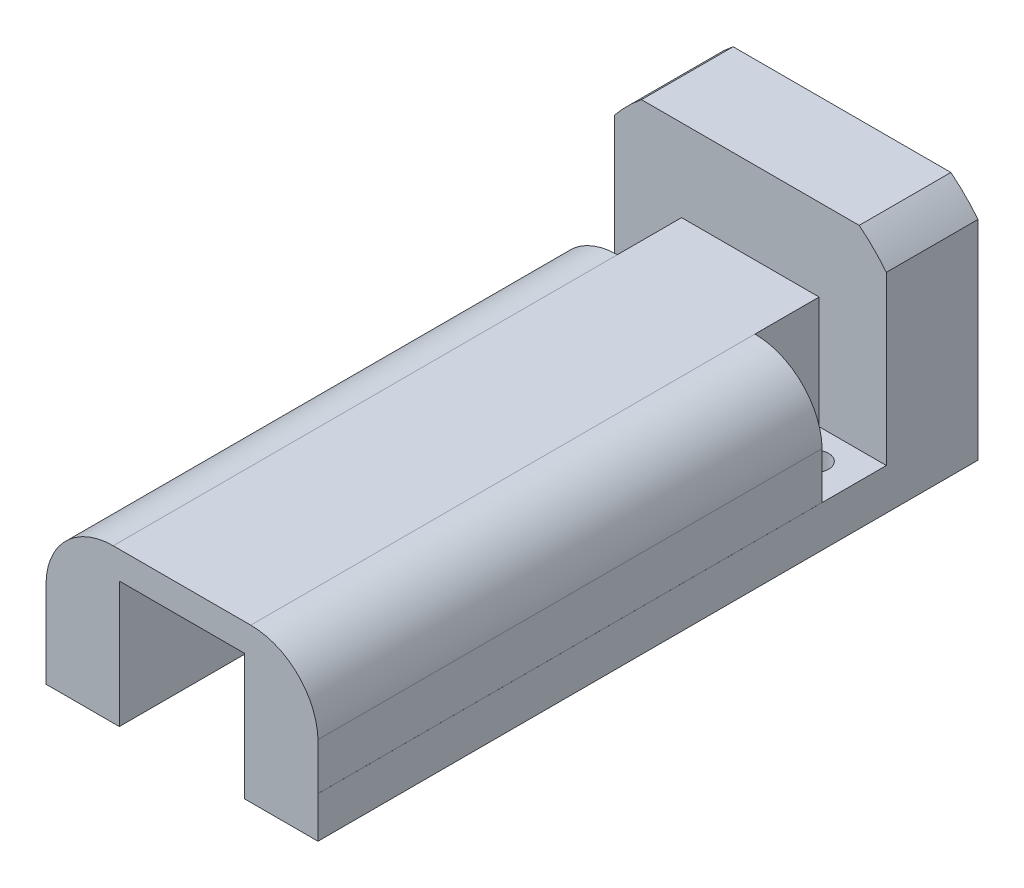
ISO-10303-21;
HEADER;
FILE_DESCRIPTION(('STEP AP214'),'2;1');
FILE_NAME('part.step','',(''),(''),'','','');
FILE_SCHEMA(('AUTOMOTIVE_DESIGN { 1 0 10303 214 1 1 1 1 }'));
ENDSEC;
DATA;
#1=APPLICATION_CONTEXT('core data for automotive mechanical design processes');
#2=APPLICATION_PROTOCOL_DEFINITION('international standard','automotive_design',2000,#1);
#3=PRODUCT_CONTEXT('',#1,'mechanical');
#4=PRODUCT('Part','Part','',(#3));
#5=PRODUCT_RELATED_PRODUCT_CATEGORY('part','',(#4));
#6=PRODUCT_DEFINITION_FORMATION('','',#4);
#7=PRODUCT_DEFINITION_CONTEXT('part definition',#1,'design');
#8=PRODUCT_DEFINITION('design','',#6,#7);
#9=PRODUCT_DEFINITION_SHAPE('','',#8);
#10=(LENGTH_UNIT() NAMED_UNIT(*) SI_UNIT(.MILLI.,.METRE.));
#11=(NAMED_UNIT(*) PLANE_ANGLE_UNIT() SI_UNIT($,.RADIAN.));
#12=(NAMED_UNIT(*) SI_UNIT($,.STERADIAN.) SOLID_ANGLE_UNIT());
#13=UNCERTAINTY_MEASURE_WITH_UNIT(LENGTH_MEASURE(1.E-05),#10,'distance_accuracy_value','');
#14=(GEOMETRIC_REPRESENTATION_CONTEXT(3) GLOBAL_UNCERTAINTY_ASSIGNED_CONTEXT((#13)) GLOBAL_UNIT_ASSIGNED_CONTEXT((#10,
#11,#12)) REPRESENTATION_CONTEXT('',''));
#15=CARTESIAN_POINT('',(0.,0.,0.));
#16=DIRECTION('',(0.,0.,1.));
#17=DIRECTION('',(1.,0.,0.));
#18=AXIS2_PLACEMENT_3D('',#15,#16,#17);
#19=CARTESIAN_POINT('',(8.35,4.5,-72.));
#20=DIRECTION('',(0.,-1.,0.));
#21=DIRECTION('',(1.,0.,0.));
#22=AXIS2_PLACEMENT_3D('',#19,#20,#21);
#23=PLANE('',#22);
#24=CARTESIAN_POINT('',(-10.5425,4.49999999999998,-58.5));
#25=DIRECTION('',(0.,1.,0.));
#26=DIRECTION('',(-1.,0.,0.));
#27=AXIS2_PLACEMENT_3D('',#24,#25,#26);
#28=CIRCLE('',#27,1.5);
#29=CARTESIAN_POINT('',(-12.0425,4.49999999999998,-58.5));
#30=VERTEX_POINT('',#29);
#31=EDGE_CURVE('E283',#30,#30,#28,.T.);
#32=ORIENTED_EDGE('',*,*,#31,.F.);
#33=EDGE_LOOP('',(#32));
#34=FACE_BOUND('',#33,.T.);
#35=DIRECTION('',(0.,0.,1.));
#36=VECTOR('',#35,1.);
#37=CARTESIAN_POINT('',(-7.5,4.5,-81.3665304068643));
#38=LINE('',#37,#36);
#39=CARTESIAN_POINT('',(-7.5,4.5,-62.));
#40=VERTEX_POINT('',#39);
#41=CARTESIAN_POINT('',(-7.5,4.5,-55.));
#42=VERTEX_POINT('',#41);
#43=EDGE_CURVE('E319',#40,#42,#38,.T.);
#44=ORIENTED_EDGE('',*,*,#43,.F.);
#45=DIRECTION('',(1.,0.,0.));
#46=VECTOR('',#45,1.);
#47=CARTESIAN_POINT('',(-14.835,4.5,-62.));
#48=LINE('',#47,#46);
#49=CARTESIAN_POINT('',(-14.835,4.5,-62.));
#50=VERTEX_POINT('',#49);
#51=EDGE_CURVE('E400',#50,#40,#48,.T.);
#52=ORIENTED_EDGE('',*,*,#51,.F.);
#53=DIRECTION('',(0.,0.,1.));
#54=VECTOR('',#53,1.);
#55=CARTESIAN_POINT('',(-14.835,4.5,-72.));
#56=LINE('',#55,#54);
#57=CARTESIAN_POINT('',(-14.835,4.5,-55.));
#58=VERTEX_POINT('',#57);
#59=EDGE_CURVE('E472',#50,#58,#56,.T.);
#60=ORIENTED_EDGE('',*,*,#59,.T.);
#61=DIRECTION('',(1.,0.,0.));
#62=VECTOR('',#61,1.);
#63=CARTESIAN_POINT('',(0.,4.5,-55.));
#64=LINE('',#63,#62);
#65=EDGE_CURVE('E347',#58,#42,#64,.T.);
#66=ORIENTED_EDGE('',*,*,#65,.T.);
#67=EDGE_LOOP('',(#44,#52,#60,#66));
#68=FACE_BOUND('',#67,.T.);
#69=ADVANCED_FACE('F46',(#34,#68),#23,.F.);
#70=CARTESIAN_POINT('',(10.5425,4.5,-58.5));
#71=DIRECTION('',(0.,1.,0.));
#72=DIRECTION('',(1.,0.,0.));
#73=AXIS2_PLACEMENT_3D('',#70,#71,#72);
#74=CIRCLE('',#73,1.5);
#75=CARTESIAN_POINT('',(12.0425,4.5,-58.5));
#76=VERTEX_POINT('',#75);
#77=EDGE_CURVE('E292',#76,#76,#74,.T.);
#78=ORIENTED_EDGE('',*,*,#77,.F.);
#79=EDGE_LOOP('',(#78));
#80=FACE_BOUND('',#79,.T.);
#81=DIRECTION('',(0.,0.,1.));
#82=VECTOR('',#81,1.);
#83=CARTESIAN_POINT('',(7.5,4.5,-81.3665304068643));
#84=LINE('',#83,#82);
#85=CARTESIAN_POINT('',(7.5,4.5,-62.));
#86=VERTEX_POINT('',#85);
#87=CARTESIAN_POINT('',(7.5,4.5,-55.));
#88=VERTEX_POINT('',#87);
#89=EDGE_CURVE('E322',#86,#88,#84,.T.);
#90=ORIENTED_EDGE('',*,*,#89,.T.);
#91=CARTESIAN_POINT('',(14.8326623480347,4.5,-55.));
#92=VERTEX_POINT('',#91);
#93=EDGE_CURVE('E306',#88,#92,#64,.T.);
#94=ORIENTED_EDGE('',*,*,#93,.T.);
#95=DIRECTION('',(0.,0.,-1.));
#96=VECTOR('',#95,1.);
#97=CARTESIAN_POINT('',(14.8326623480347,4.5,32.0972380306624));
#98=LINE('',#97,#96);
#99=CARTESIAN_POINT('',(14.8326623480347,4.5,0.));
#100=VERTEX_POINT('',#99);
#101=EDGE_CURVE('E334',#100,#92,#98,.T.);
#102=ORIENTED_EDGE('',*,*,#101,.F.);
#103=DIRECTION('',(1.,0.,0.));
#104=VECTOR('',#103,1.);
#105=CARTESIAN_POINT('',(8.35,4.5,0.));
#106=LINE('',#105,#104);
#107=CARTESIAN_POINT('',(14.835,4.5,0.));
#108=VERTEX_POINT('',#107);
#109=EDGE_CURVE('E460',#100,#108,#106,.T.);
#110=ORIENTED_EDGE('',*,*,#109,.T.);
#111=DIRECTION('',(0.,0.,1.));
#112=VECTOR('',#111,1.);
#113=CARTESIAN_POINT('',(14.835,4.5,-72.));
#114=LINE('',#113,#112);
#115=CARTESIAN_POINT('',(14.835,4.5,-62.));
#116=VERTEX_POINT('',#115);
#117=EDGE_CURVE('E468',#116,#108,#114,.T.);
#118=ORIENTED_EDGE('',*,*,#117,.F.);
#119=EDGE_CURVE('E399',#86,#116,#48,.T.);
#120=ORIENTED_EDGE('',*,*,#119,.F.);
#121=EDGE_LOOP('',(#90,#94,#102,#110,#118,#120));
#122=FACE_BOUND('',#121,.T.);
#123=ADVANCED_FACE('F518',(#80,#122),#23,.F.);
#124=CARTESIAN_POINT('',(0.00192709148594142,10.8747780814861,-62.));
#125=DIRECTION('',(0.,0.,1.));
#126=DIRECTION('',(1.,0.,0.));
#127=AXIS2_PLACEMENT_3D('',#124,#125,#126);
#128=PLANE('',#127);
#129=ORIENTED_EDGE('',*,*,#51,.T.);
#130=DIRECTION('',(0.,-1.,0.));
#131=VECTOR('',#130,1.);
#132=CARTESIAN_POINT('',(-7.5,16.75,-62.));
#133=LINE('',#132,#131);
#134=CARTESIAN_POINT('',(-7.5,16.75,-62.));
#135=VERTEX_POINT('',#134);
#136=EDGE_CURVE('E299',#135,#40,#133,.T.);
#137=ORIENTED_EDGE('',*,*,#136,.F.);
#138=DIRECTION('',(-1.,0.,0.));
#139=VECTOR('',#138,1.);
#140=CARTESIAN_POINT('',(7.5,16.75,-62.));
#141=LINE('',#140,#139);
#142=CARTESIAN_POINT('',(7.5,16.75,-62.));
#143=VERTEX_POINT('',#142);
#144=EDGE_CURVE('E303',#143,#135,#141,.T.);
#145=ORIENTED_EDGE('',*,*,#144,.F.);
#146=DIRECTION('',(0.,1.,0.));
#147=VECTOR('',#146,1.);
#148=CARTESIAN_POINT('',(7.5,16.75,-62.));
#149=LINE('',#148,#147);
#150=EDGE_CURVE('E302',#86,#143,#149,.T.);
#151=ORIENTED_EDGE('',*,*,#150,.F.);
#152=ORIENTED_EDGE('',*,*,#119,.T.);
#153=DIRECTION('',(0.,1.,0.));
#154=VECTOR('',#153,1.);
#155=CARTESIAN_POINT('',(14.835,4.5,-62.));
#156=LINE('',#155,#154);
#157=CARTESIAN_POINT('',(14.835,22.7482757992321,-62.));
#158=VERTEX_POINT('',#157);
#159=EDGE_CURVE('E404',#116,#158,#156,.T.);
#160=ORIENTED_EDGE('',*,*,#159,.T.);
#161=CARTESIAN_POINT('',(0.00192709148594142,10.8747780814861,-62.));
#162=DIRECTION('',(0.,0.,1.));
#163=DIRECTION('',(1.,0.,0.));
#164=AXIS2_PLACEMENT_3D('',#161,#162,#163);
#165=CIRCLE('',#164,18.9999999990162);
#166=CARTESIAN_POINT('',(11.8754248092322,25.70785099,-62.));
#167=VERTEX_POINT('',#166);
#168=EDGE_CURVE('E346',#158,#167,#165,.T.);
#169=ORIENTED_EDGE('',*,*,#168,.T.);
#170=DIRECTION('',(-1.,0.,0.));
#171=VECTOR('',#170,1.);
#172=CARTESIAN_POINT('',(11.8754248092322,25.70785099,-62.));
#173=LINE('',#172,#171);
#174=CARTESIAN_POINT('',(-11.8754248092322,25.70785099,-62.));
#175=VERTEX_POINT('',#174);
#176=EDGE_CURVE('E387',#167,#175,#173,.T.);
#177=ORIENTED_EDGE('',*,*,#176,.T.);
#178=CARTESIAN_POINT('',(-0.00192709148594142,10.8747780814861,-62.));
#179=DIRECTION('',(0.,0.,1.));
#180=DIRECTION('',(1.,0.,0.));
#181=AXIS2_PLACEMENT_3D('',#178,#179,#180);
#182=CIRCLE('',#181,18.9999999990162);
#183=CARTESIAN_POINT('',(-14.835,22.7482757992321,-62.));
#184=VERTEX_POINT('',#183);
#185=EDGE_CURVE('E391',#175,#184,#182,.T.);
#186=ORIENTED_EDGE('',*,*,#185,.T.);
#187=DIRECTION('',(0.,-1.,0.));
#188=VECTOR('',#187,1.);
#189=CARTESIAN_POINT('',(-14.835,4.5,-62.));
#190=LINE('',#189,#188);
#191=EDGE_CURVE('E395',#184,#50,#190,.T.);
#192=ORIENTED_EDGE('',*,*,#191,.T.);
#193=EDGE_LOOP('',(#129,#137,#145,#151,#152,#160,#169,#177,#186,#192));
#194=FACE_BOUND('',#193,.T.);
#195=ADVANCED_FACE('F513',(#194),#128,.T.);
#196=CARTESIAN_POINT('',(0.,0.,-55.));
#197=DIRECTION('',(0.,0.,1.));
#198=DIRECTION('',(1.,0.,0.));
#199=AXIS2_PLACEMENT_3D('',#196,#197,#198);
#200=PLANE('',#199);
#201=DIRECTION('',(0.,1.,0.));
#202=VECTOR('',#201,1.);
#203=CARTESIAN_POINT('',(-7.5,16.75,-55.));
#204=LINE('',#203,#202);
#205=CARTESIAN_POINT('',(-7.5,16.75,-55.));
#206=VERTEX_POINT('',#205);
#207=EDGE_CURVE('E309',#42,#206,#204,.T.);
#208=ORIENTED_EDGE('',*,*,#207,.F.);
#209=ORIENTED_EDGE('',*,*,#65,.F.);
#210=DIRECTION('',(0.,-1.,0.));
#211=VECTOR('',#210,1.);
#212=CARTESIAN_POINT('',(-14.835,0.,-55.));
#213=LINE('',#212,#211);
#214=CARTESIAN_POINT('',(-14.835,9.41500000000001,-55.));
#215=VERTEX_POINT('',#214);
#216=EDGE_CURVE('E363',#215,#58,#213,.T.);
#217=ORIENTED_EDGE('',*,*,#216,.F.);
#218=CARTESIAN_POINT('',(-7.5,9.415,-55.));
#219=DIRECTION('',(0.,0.,1.));
#220=DIRECTION('',(1.,0.,0.));
#221=AXIS2_PLACEMENT_3D('',#218,#219,#220);
#222=CIRCLE('',#221,7.335);
#223=EDGE_CURVE('E359',#206,#215,#222,.T.);
#224=ORIENTED_EDGE('',*,*,#223,.F.);
#225=EDGE_LOOP('',(#208,#209,#217,#224));
#226=FACE_BOUND('',#225,.T.);
#227=ADVANCED_FACE('F544',(#226),#200,.F.);
#228=DIRECTION('',(0.,-1.,0.));
#229=VECTOR('',#228,1.);
#230=CARTESIAN_POINT('',(7.5,16.75,-55.));
#231=LINE('',#230,#229);
#232=CARTESIAN_POINT('',(7.5,16.75,-55.));
#233=VERTEX_POINT('',#232);
#234=EDGE_CURVE('E287',#233,#88,#231,.T.);
#235=ORIENTED_EDGE('',*,*,#234,.F.);
#236=CARTESIAN_POINT('',(7.5,9.415,-55.));
#237=DIRECTION('',(0.,0.,1.));
#238=DIRECTION('',(1.,0.,0.));
#239=AXIS2_PLACEMENT_3D('',#236,#237,#238);
#240=CIRCLE('',#239,7.335);
#241=CARTESIAN_POINT('',(14.8326623480347,9.60016989418844,-55.));
#242=VERTEX_POINT('',#241);
#243=EDGE_CURVE('E355',#242,#233,#240,.T.);
#244=ORIENTED_EDGE('',*,*,#243,.F.);
#245=DIRECTION('',(0.,1.,0.));
#246=VECTOR('',#245,1.);
#247=CARTESIAN_POINT('',(14.8326623480347,0.,-55.));
#248=LINE('',#247,#246);
#249=EDGE_CURVE('E351',#92,#242,#248,.T.);
#250=ORIENTED_EDGE('',*,*,#249,.F.);
#251=ORIENTED_EDGE('',*,*,#93,.F.);
#252=EDGE_LOOP('',(#235,#244,#250,#251));
#253=FACE_BOUND('',#252,.T.);
#254=ADVANCED_FACE('F559',(#253),#200,.F.);
#255=CARTESIAN_POINT('',(0.,0.,-72.));
#256=DIRECTION('',(0.,0.,-1.));
#257=DIRECTION('',(-1.,0.,0.));
#258=AXIS2_PLACEMENT_3D('',#255,#256,#257);
#259=PLANE('',#258);
#260=DIRECTION('',(0.,1.,0.));
#261=VECTOR('',#260,1.);
#262=CARTESIAN_POINT('',(-11.85,22.72285099,-72.));
#263=LINE('',#262,#261);
#264=CARTESIAN_POINT('',(-11.85,0.,-72.));
#265=VERTEX_POINT('',#264);
#266=CARTESIAN_POINT('',(-11.85,22.72285099,-72.));
#267=VERTEX_POINT('',#266);
#268=EDGE_CURVE('E243',#265,#267,#263,.T.);
#269=ORIENTED_EDGE('',*,*,#268,.F.);
#270=DIRECTION('',(1.,0.,0.));
#271=VECTOR('',#270,1.);
#272=CARTESIAN_POINT('',(-14.835,0.,-72.));
#273=LINE('',#272,#271);
#274=CARTESIAN_POINT('',(-14.835,0.,-72.));
#275=VERTEX_POINT('',#274);
#276=EDGE_CURVE('E436',#275,#265,#273,.T.);
#277=ORIENTED_EDGE('',*,*,#276,.F.);
#278=DIRECTION('',(0.,1.,0.));
#279=VECTOR('',#278,1.);
#280=CARTESIAN_POINT('',(-14.835,0.,-72.));
#281=LINE('',#280,#279);
#282=CARTESIAN_POINT('',(-14.835,22.7482757992321,-72.));
#283=VERTEX_POINT('',#282);
#284=EDGE_CURVE('E441',#275,#283,#281,.T.);
#285=ORIENTED_EDGE('',*,*,#284,.T.);
#286=CARTESIAN_POINT('',(-0.00192709148594142,10.8747780814861,-72.));
#287=DIRECTION('',(0.,0.,1.));
#288=DIRECTION('',(1.,0.,0.));
#289=AXIS2_PLACEMENT_3D('',#286,#287,#288);
#290=CIRCLE('',#289,18.9999999990162);
#291=CARTESIAN_POINT('',(-11.8754248092322,25.70785099,-72.));
#292=VERTEX_POINT('',#291);
#293=EDGE_CURVE('E408',#292,#283,#290,.T.);
#294=ORIENTED_EDGE('',*,*,#293,.F.);
#295=DIRECTION('',(-1.,0.,0.));
#296=VECTOR('',#295,1.);
#297=CARTESIAN_POINT('',(0.,25.70785099,-72.));
#298=LINE('',#297,#296);
#299=CARTESIAN_POINT('',(11.8754248092322,25.70785099,-72.));
#300=VERTEX_POINT('',#299);
#301=EDGE_CURVE('E428',#300,#292,#298,.T.);
#302=ORIENTED_EDGE('',*,*,#301,.F.);
#303=CARTESIAN_POINT('',(0.00192709148594142,10.8747780814861,-72.));
#304=DIRECTION('',(0.,0.,1.));
#305=DIRECTION('',(-1.,0.,0.));
#306=AXIS2_PLACEMENT_3D('',#303,#304,#305);
#307=CIRCLE('',#306,18.9999999990162);
#308=CARTESIAN_POINT('',(14.835,22.7482757992321,-72.));
#309=VERTEX_POINT('',#308);
#310=EDGE_CURVE('E409',#309,#300,#307,.T.);
#311=ORIENTED_EDGE('',*,*,#310,.F.);
#312=DIRECTION('',(0.,1.,0.));
#313=VECTOR('',#312,1.);
#314=CARTESIAN_POINT('',(14.835,0.,-72.));
#315=LINE('',#314,#313);
#316=CARTESIAN_POINT('',(14.835,0.,-72.));
#317=VERTEX_POINT('',#316);
#318=EDGE_CURVE('E445',#317,#309,#315,.T.);
#319=ORIENTED_EDGE('',*,*,#318,.F.);
#320=DIRECTION('',(-1.,0.,0.));
#321=VECTOR('',#320,1.);
#322=CARTESIAN_POINT('',(14.835,0.,-72.));
#323=LINE('',#322,#321);
#324=CARTESIAN_POINT('',(11.85,0.,-72.));
#325=VERTEX_POINT('',#324);
#326=EDGE_CURVE('E432',#317,#325,#323,.T.);
#327=ORIENTED_EDGE('',*,*,#326,.T.);
#328=DIRECTION('',(0.,-1.,0.));
#329=VECTOR('',#328,1.);
#330=CARTESIAN_POINT('',(11.85,0.,-72.));
#331=LINE('',#330,#329);
#332=CARTESIAN_POINT('',(11.85,22.72285099,-72.));
#333=VERTEX_POINT('',#332);
#334=EDGE_CURVE('E260',#333,#325,#331,.T.);
#335=ORIENTED_EDGE('',*,*,#334,.F.);
#336=DIRECTION('',(1.,0.,0.));
#337=VECTOR('',#336,1.);
#338=CARTESIAN_POINT('',(11.85,22.72285099,-72.));
#339=LINE('',#338,#337);
#340=EDGE_CURVE('E256',#267,#333,#339,.T.);
#341=ORIENTED_EDGE('',*,*,#340,.F.);
#342=EDGE_LOOP('',(#269,#277,#285,#294,#302,#311,#319,#327,#335,#341));
#343=FACE_BOUND('',#342,.T.);
#344=ADVANCED_FACE('F496',(#343),#259,.T.);
#345=CARTESIAN_POINT('',(14.835,0.,-72.));
#346=DIRECTION('',(0.,1.,0.));
#347=DIRECTION('',(0.,0.,1.));
#348=AXIS2_PLACEMENT_3D('',#345,#346,#347);
#349=PLANE('',#348);
#350=CARTESIAN_POINT('',(10.5425,0.,-58.5));
#351=DIRECTION('',(0.,1.,0.));
#352=DIRECTION('',(0.,0.,1.));
#353=AXIS2_PLACEMENT_3D('',#350,#351,#352);
#354=CIRCLE('',#353,1.5);
#355=CARTESIAN_POINT('',(10.5425,0.,-57.));
#356=VERTEX_POINT('',#355);
#357=EDGE_CURVE('E282',#356,#356,#354,.F.);
#358=ORIENTED_EDGE('',*,*,#357,.F.);
#359=EDGE_LOOP('',(#358));
#360=FACE_BOUND('',#359,.T.);
#361=DIRECTION('',(-1.,0.,0.));
#362=VECTOR('',#361,1.);
#363=CARTESIAN_POINT('',(11.85,0.,-65.));
#364=LINE('',#363,#362);
#365=CARTESIAN_POINT('',(11.85,0.,-65.));
#366=VERTEX_POINT('',#365);
#367=CARTESIAN_POINT('',(6.83500000000001,0.,-65.));
#368=VERTEX_POINT('',#367);
#369=EDGE_CURVE('E248',#366,#368,#364,.T.);
#370=ORIENTED_EDGE('',*,*,#369,.F.);
#371=DIRECTION('',(0.,0.,-1.));
#372=VECTOR('',#371,1.);
#373=CARTESIAN_POINT('',(11.85,0.,-65.));
#374=LINE('',#373,#372);
#375=EDGE_CURVE('E272',#366,#325,#374,.T.);
#376=ORIENTED_EDGE('',*,*,#375,.T.);
#377=ORIENTED_EDGE('',*,*,#326,.F.);
#378=DIRECTION('',(0.,0.,1.));
#379=VECTOR('',#378,1.);
#380=CARTESIAN_POINT('',(14.835,0.,-72.));
#381=LINE('',#380,#379);
#382=CARTESIAN_POINT('',(14.835,0.,0.));
#383=VERTEX_POINT('',#382);
#384=EDGE_CURVE('E449',#317,#383,#381,.T.);
#385=ORIENTED_EDGE('',*,*,#384,.T.);
#386=DIRECTION('',(-1.,0.,0.));
#387=VECTOR('',#386,1.);
#388=CARTESIAN_POINT('',(14.835,0.,0.));
#389=LINE('',#388,#387);
#390=CARTESIAN_POINT('',(6.835,0.,0.));
#391=VERTEX_POINT('',#390);
#392=EDGE_CURVE('E217',#383,#391,#389,.T.);
#393=ORIENTED_EDGE('',*,*,#392,.T.);
#394=DIRECTION('',(0.,0.,1.));
#395=VECTOR('',#394,1.);
#396=CARTESIAN_POINT('',(6.835,0.,-72.));
#397=LINE('',#396,#395);
#398=EDGE_CURVE('E11',#368,#391,#397,.T.);
#399=ORIENTED_EDGE('',*,*,#398,.F.);
#400=EDGE_LOOP('',(#370,#376,#377,#385,#393,#399));
#401=FACE_BOUND('',#400,.T.);
#402=ADVANCED_FACE('F48',(#360,#401),#349,.F.);
#403=CARTESIAN_POINT('',(6.835,0.,-72.));
#404=DIRECTION('',(1.,0.,0.));
#405=DIRECTION('',(0.,0.,-1.));
#406=AXIS2_PLACEMENT_3D('',#403,#404,#405);
#407=PLANE('',#406);
#408=DIRECTION('',(0.,1.,0.));
#409=VECTOR('',#408,1.);
#410=CARTESIAN_POINT('',(6.835,0.,0.));
#411=LINE('',#410,#409);
#412=CARTESIAN_POINT('',(6.835,13.75,0.));
#413=VERTEX_POINT('',#412);
#414=EDGE_CURVE('E205',#391,#413,#411,.T.);
#415=ORIENTED_EDGE('',*,*,#414,.T.);
#416=DIRECTION('',(0.,0.,1.));
#417=VECTOR('',#416,1.);
#418=CARTESIAN_POINT('',(6.835,13.75,-82.3905549077653));
#419=LINE('',#418,#417);
#420=CARTESIAN_POINT('',(6.835,13.75,-65.));
#421=VERTEX_POINT('',#420);
#422=EDGE_CURVE('E208',#421,#413,#419,.T.);
#423=ORIENTED_EDGE('',*,*,#422,.F.);
#424=DIRECTION('',(0.,-1.,0.));
#425=VECTOR('',#424,1.);
#426=CARTESIAN_POINT('',(6.835,0.,-65.));
#427=LINE('',#426,#425);
#428=EDGE_CURVE('E62',#421,#368,#427,.T.);
#429=ORIENTED_EDGE('',*,*,#428,.T.);
#430=ORIENTED_EDGE('',*,*,#398,.T.);
#431=EDGE_LOOP('',(#415,#423,#429,#430));
#432=FACE_BOUND('',#431,.T.);
#433=ADVANCED_FACE('F207',(#432),#407,.F.);
#434=CARTESIAN_POINT('',(-6.835,0.,-72.));
#435=DIRECTION('',(1.,0.,0.));
#436=DIRECTION('',(0.,0.,-1.));
#437=AXIS2_PLACEMENT_3D('',#434,#435,#436);
#438=PLANE('',#437);
#439=DIRECTION('',(0.,-1.,0.));
#440=VECTOR('',#439,1.);
#441=CARTESIAN_POINT('',(-6.835,0.,-65.));
#442=LINE('',#441,#440);
#443=CARTESIAN_POINT('',(-6.835,13.75,-65.));
#444=VERTEX_POINT('',#443);
#445=CARTESIAN_POINT('',(-6.835,0.,-65.));
#446=VERTEX_POINT('',#445);
#447=EDGE_CURVE('E68',#444,#446,#442,.T.);
#448=ORIENTED_EDGE('',*,*,#447,.F.);
#449=DIRECTION('',(0.,0.,1.));
#450=VECTOR('',#449,1.);
#451=CARTESIAN_POINT('',(-6.835,13.75,-82.3905549077653));
#452=LINE('',#451,#450);
#453=CARTESIAN_POINT('',(-6.835,13.75,0.));
#454=VERTEX_POINT('',#453);
#455=EDGE_CURVE('E226',#444,#454,#452,.T.);
#456=ORIENTED_EDGE('',*,*,#455,.T.);
#457=DIRECTION('',(0.,1.,0.));
#458=VECTOR('',#457,1.);
#459=CARTESIAN_POINT('',(-6.835,0.,0.));
#460=LINE('',#459,#458);
#461=CARTESIAN_POINT('',(-6.835,0.,0.));
#462=VERTEX_POINT('',#461);
#463=EDGE_CURVE('E216',#462,#454,#460,.T.);
#464=ORIENTED_EDGE('',*,*,#463,.F.);
#465=DIRECTION('',(0.,0.,1.));
#466=VECTOR('',#465,1.);
#467=CARTESIAN_POINT('',(-6.835,0.,-72.));
#468=LINE('',#467,#466);
#469=EDGE_CURVE('E55',#446,#462,#468,.T.);
#470=ORIENTED_EDGE('',*,*,#469,.F.);
#471=EDGE_LOOP('',(#448,#456,#464,#470));
#472=FACE_BOUND('',#471,.T.);
#473=ADVANCED_FACE('F485',(#472),#438,.T.);
#474=CARTESIAN_POINT('',(-14.835,0.,-72.));
#475=DIRECTION('',(0.,-1.,0.));
#476=DIRECTION('',(0.,0.,-1.));
#477=AXIS2_PLACEMENT_3D('',#474,#475,#476);
#478=PLANE('',#477);
#479=DIRECTION('',(0.,0.,-1.));
#480=VECTOR('',#479,1.);
#481=CARTESIAN_POINT('',(-11.85,0.,-65.));
#482=LINE('',#481,#480);
#483=CARTESIAN_POINT('',(-11.85,0.,-65.));
#484=VERTEX_POINT('',#483);
#485=EDGE_CURVE('E269',#484,#265,#482,.T.);
#486=ORIENTED_EDGE('',*,*,#485,.F.);
#487=EDGE_CURVE('E247',#446,#484,#364,.T.);
#488=ORIENTED_EDGE('',*,*,#487,.F.);
#489=ORIENTED_EDGE('',*,*,#469,.T.);
#490=DIRECTION('',(1.,0.,0.));
#491=VECTOR('',#490,1.);
#492=CARTESIAN_POINT('',(-14.835,0.,0.));
#493=LINE('',#492,#491);
#494=CARTESIAN_POINT('',(-14.835,0.,0.));
#495=VERTEX_POINT('',#494);
#496=EDGE_CURVE('E454',#495,#462,#493,.T.);
#497=ORIENTED_EDGE('',*,*,#496,.F.);
#498=DIRECTION('',(0.,0.,1.));
#499=VECTOR('',#498,1.);
#500=CARTESIAN_POINT('',(-14.835,0.,-72.));
#501=LINE('',#500,#499);
#502=EDGE_CURVE('E475',#275,#495,#501,.T.);
#503=ORIENTED_EDGE('',*,*,#502,.F.);
#504=ORIENTED_EDGE('',*,*,#276,.T.);
#505=EDGE_LOOP('',(#486,#488,#489,#497,#503,#504));
#506=FACE_BOUND('',#505,.T.);
#507=CARTESIAN_POINT('',(-10.5425,0.,-58.5));
#508=DIRECTION('',(0.,-1.,0.));
#509=DIRECTION('',(0.,0.,-1.));
#510=AXIS2_PLACEMENT_3D('',#507,#508,#509);
#511=CIRCLE('',#510,1.5);
#512=CARTESIAN_POINT('',(-10.5425,0.,-60.));
#513=VERTEX_POINT('',#512);
#514=EDGE_CURVE('E288',#513,#513,#511,.F.);
#515=ORIENTED_EDGE('',*,*,#514,.T.);
#516=EDGE_LOOP('',(#515));
#517=FACE_BOUND('',#516,.T.);
#518=ADVANCED_FACE('F482',(#506,#517),#478,.T.);
#519=CARTESIAN_POINT('',(-14.835,0.,-72.));
#520=DIRECTION('',(1.,0.,0.));
#521=DIRECTION('',(0.,1.,0.));
#522=AXIS2_PLACEMENT_3D('',#519,#520,#521);
#523=PLANE('',#522);
#524=ORIENTED_EDGE('',*,*,#191,.F.);
#525=DIRECTION('',(0.,0.,-1.));
#526=VECTOR('',#525,1.);
#527=CARTESIAN_POINT('',(-14.835,22.7482757992321,-62.2561154477179));
#528=LINE('',#527,#526);
#529=EDGE_CURVE('E417',#184,#283,#528,.T.);
#530=ORIENTED_EDGE('',*,*,#529,.T.);
#531=ORIENTED_EDGE('',*,*,#284,.F.);
#532=ORIENTED_EDGE('',*,*,#502,.T.);
#533=DIRECTION('',(0.,1.,0.));
#534=VECTOR('',#533,1.);
#535=CARTESIAN_POINT('',(-14.835,0.,0.));
#536=LINE('',#535,#534);
#537=CARTESIAN_POINT('',(-14.835,9.41500000000001,0.));
#538=VERTEX_POINT('',#537);
#539=EDGE_CURVE('E457',#495,#538,#536,.T.);
#540=ORIENTED_EDGE('',*,*,#539,.T.);
#541=DIRECTION('',(0.,0.,-1.));
#542=VECTOR('',#541,1.);
#543=CARTESIAN_POINT('',(-14.835,9.41500000000001,32.0972380306624));
#544=LINE('',#543,#542);
#545=EDGE_CURVE('E367',#538,#215,#544,.T.);
#546=ORIENTED_EDGE('',*,*,#545,.T.);
#547=ORIENTED_EDGE('',*,*,#216,.T.);
#548=ORIENTED_EDGE('',*,*,#59,.F.);
#549=EDGE_LOOP('',(#524,#530,#531,#532,#540,#546,#547,#548));
#550=FACE_BOUND('',#549,.T.);
#551=ADVANCED_FACE('F491',(#550),#523,.F.);
#552=CARTESIAN_POINT('',(14.835,0.,-72.));
#553=DIRECTION('',(1.,0.,0.));
#554=DIRECTION('',(0.,0.,-1.));
#555=AXIS2_PLACEMENT_3D('',#552,#553,#554);
#556=PLANE('',#555);
#557=ORIENTED_EDGE('',*,*,#159,.F.);
#558=ORIENTED_EDGE('',*,*,#117,.T.);
#559=DIRECTION('',(0.,1.,0.));
#560=VECTOR('',#559,1.);
#561=CARTESIAN_POINT('',(14.835,0.,0.));
#562=LINE('',#561,#560);
#563=EDGE_CURVE('E437',#383,#108,#562,.T.);
#564=ORIENTED_EDGE('',*,*,#563,.F.);
#565=ORIENTED_EDGE('',*,*,#384,.F.);
#566=ORIENTED_EDGE('',*,*,#318,.T.);
#567=DIRECTION('',(0.,0.,-1.));
#568=VECTOR('',#567,1.);
#569=CARTESIAN_POINT('',(14.835,22.7482757992321,-62.2561154477179));
#570=LINE('',#569,#568);
#571=EDGE_CURVE('E425',#158,#309,#570,.T.);
#572=ORIENTED_EDGE('',*,*,#571,.F.);
#573=EDGE_LOOP('',(#557,#558,#564,#565,#566,#572));
#574=FACE_BOUND('',#573,.T.);
#575=ADVANCED_FACE('F522',(#574),#556,.T.);
#576=CARTESIAN_POINT('',(0.,0.,0.));
#577=DIRECTION('',(0.,0.,-1.));
#578=DIRECTION('',(-1.,0.,0.));
#579=AXIS2_PLACEMENT_3D('',#576,#577,#578);
#580=PLANE('',#579);
#581=ORIENTED_EDGE('',*,*,#463,.T.);
#582=DIRECTION('',(-1.,0.,0.));
#583=VECTOR('',#582,1.);
#584=CARTESIAN_POINT('',(-6.835,13.75,0.));
#585=LINE('',#584,#583);
#586=EDGE_CURVE('E223',#413,#454,#585,.T.);
#587=ORIENTED_EDGE('',*,*,#586,.F.);
#588=ORIENTED_EDGE('',*,*,#414,.F.);
#589=ORIENTED_EDGE('',*,*,#392,.F.);
#590=ORIENTED_EDGE('',*,*,#563,.T.);
#591=ORIENTED_EDGE('',*,*,#109,.F.);
#592=DIRECTION('',(0.,-1.,0.));
#593=VECTOR('',#592,1.);
#594=CARTESIAN_POINT('',(14.8326623480347,0.,0.));
#595=LINE('',#594,#593);
#596=CARTESIAN_POINT('',(14.8326623480347,9.60016989418844,0.));
#597=VERTEX_POINT('',#596);
#598=EDGE_CURVE('E342',#597,#100,#595,.T.);
#599=ORIENTED_EDGE('',*,*,#598,.F.);
#600=CARTESIAN_POINT('',(7.5,9.415,0.));
#601=DIRECTION('',(0.,0.,-1.));
#602=DIRECTION('',(-1.,0.,0.));
#603=AXIS2_PLACEMENT_3D('',#600,#601,#602);
#604=CIRCLE('',#603,7.335);
#605=CARTESIAN_POINT('',(7.5,16.75,0.));
#606=VERTEX_POINT('',#605);
#607=EDGE_CURVE('E338',#606,#597,#604,.T.);
#608=ORIENTED_EDGE('',*,*,#607,.F.);
#609=DIRECTION('',(1.,0.,0.));
#610=VECTOR('',#609,1.);
#611=CARTESIAN_POINT('',(0.,16.75,0.));
#612=LINE('',#611,#610);
#613=CARTESIAN_POINT('',(-7.5,16.75,0.));
#614=VERTEX_POINT('',#613);
#615=EDGE_CURVE('E333',#614,#606,#612,.T.);
#616=ORIENTED_EDGE('',*,*,#615,.F.);
#617=CARTESIAN_POINT('',(-7.5,9.415,0.));
#618=DIRECTION('',(0.,0.,-1.));
#619=DIRECTION('',(-1.,0.,0.));
#620=AXIS2_PLACEMENT_3D('',#617,#618,#619);
#621=CIRCLE('',#620,7.335);
#622=EDGE_CURVE('E329',#538,#614,#621,.T.);
#623=ORIENTED_EDGE('',*,*,#622,.F.);
#624=ORIENTED_EDGE('',*,*,#539,.F.);
#625=ORIENTED_EDGE('',*,*,#496,.T.);
#626=EDGE_LOOP('',(#581,#587,#588,#589,#590,#591,#599,#608,#616,#623,#624,#625));
#627=FACE_BOUND('',#626,.T.);
#628=ADVANCED_FACE('F228',(#627),#580,.F.);
#629=CARTESIAN_POINT('',(0.,25.70785099,-67.));
#630=DIRECTION('',(0.,-1.,0.));
#631=DIRECTION('',(0.,0.,-1.));
#632=AXIS2_PLACEMENT_3D('',#629,#630,#631);
#633=PLANE('',#632);
#634=DIRECTION('',(0.,0.,-1.));
#635=VECTOR('',#634,1.);
#636=CARTESIAN_POINT('',(-11.8754248092322,25.70785099,-62.2561154477179));
#637=LINE('',#636,#635);
#638=EDGE_CURVE('E412',#292,#175,#637,.F.);
#639=ORIENTED_EDGE('',*,*,#638,.T.);
#640=ORIENTED_EDGE('',*,*,#176,.F.);
#641=DIRECTION('',(0.,0.,-1.));
#642=VECTOR('',#641,1.);
#643=CARTESIAN_POINT('',(11.8754248092322,25.70785099,-62.2561154477179));
#644=LINE('',#643,#642);
#645=EDGE_CURVE('E421',#167,#300,#644,.T.);
#646=ORIENTED_EDGE('',*,*,#645,.T.);
#647=ORIENTED_EDGE('',*,*,#301,.T.);
#648=EDGE_LOOP('',(#639,#640,#646,#647));
#649=FACE_BOUND('',#648,.T.);
#650=ADVANCED_FACE('F529',(#649),#633,.F.);
#651=CARTESIAN_POINT('',(-0.00192709148594142,10.8747780814861,-62.2561154477179));
#652=DIRECTION('',(0.,0.,-1.));
#653=DIRECTION('',(-1.,0.,0.));
#654=AXIS2_PLACEMENT_3D('',#651,#652,#653);
#655=CYLINDRICAL_SURFACE('',#654,18.9999999990162);
#656=ORIENTED_EDGE('',*,*,#529,.F.);
#657=ORIENTED_EDGE('',*,*,#185,.F.);
#658=ORIENTED_EDGE('',*,*,#638,.F.);
#659=ORIENTED_EDGE('',*,*,#293,.T.);
#660=EDGE_LOOP('',(#656,#657,#658,#659));
#661=FACE_BOUND('',#660,.T.);
#662=ADVANCED_FACE('F533',(#661),#655,.T.);
#663=CARTESIAN_POINT('',(0.00192709148594142,10.8747780814861,-62.2561154477179));
#664=DIRECTION('',(0.,0.,-1.));
#665=DIRECTION('',(-1.,0.,0.));
#666=AXIS2_PLACEMENT_3D('',#663,#664,#665);
#667=CYLINDRICAL_SURFACE('',#666,18.9999999990162);
#668=ORIENTED_EDGE('',*,*,#571,.T.);
#669=ORIENTED_EDGE('',*,*,#310,.T.);
#670=ORIENTED_EDGE('',*,*,#645,.F.);
#671=ORIENTED_EDGE('',*,*,#168,.F.);
#672=EDGE_LOOP('',(#668,#669,#670,#671));
#673=FACE_BOUND('',#672,.T.);
#674=ADVANCED_FACE('F526',(#673),#667,.T.);
#675=CARTESIAN_POINT('',(-7.5,9.415,32.0972380306624));
#676=DIRECTION('',(0.,0.,-1.));
#677=DIRECTION('',(-1.,0.,0.));
#678=AXIS2_PLACEMENT_3D('',#675,#676,#677);
#679=CYLINDRICAL_SURFACE('',#678,7.335);
#680=ORIENTED_EDGE('',*,*,#545,.F.);
#681=ORIENTED_EDGE('',*,*,#622,.T.);
#682=DIRECTION('',(0.,0.,-1.));
#683=VECTOR('',#682,1.);
#684=CARTESIAN_POINT('',(-7.5,16.75,32.0972380306624));
#685=LINE('',#684,#683);
#686=EDGE_CURVE('E370',#614,#206,#685,.T.);
#687=ORIENTED_EDGE('',*,*,#686,.T.);
#688=ORIENTED_EDGE('',*,*,#223,.T.);
#689=EDGE_LOOP('',(#680,#681,#687,#688));
#690=FACE_BOUND('',#689,.T.);
#691=ADVANCED_FACE('F547',(#690),#679,.T.);
#692=CARTESIAN_POINT('',(0.,16.75,32.0972380306624));
#693=DIRECTION('',(0.,-1.,0.));
#694=DIRECTION('',(1.,0.,0.));
#695=AXIS2_PLACEMENT_3D('',#692,#693,#694);
#696=PLANE('',#695);
#697=ORIENTED_EDGE('',*,*,#686,.F.);
#698=ORIENTED_EDGE('',*,*,#615,.T.);
#699=DIRECTION('',(0.,0.,-1.));
#700=VECTOR('',#699,1.);
#701=CARTESIAN_POINT('',(7.5,16.75,32.0972380306624));
#702=LINE('',#701,#700);
#703=EDGE_CURVE('E374',#606,#233,#702,.T.);
#704=ORIENTED_EDGE('',*,*,#703,.T.);
#705=DIRECTION('',(0.,0.,1.));
#706=VECTOR('',#705,1.);
#707=CARTESIAN_POINT('',(7.5,16.75,-81.3665304068643));
#708=LINE('',#707,#706);
#709=EDGE_CURVE('E312',#143,#233,#708,.T.);
#710=ORIENTED_EDGE('',*,*,#709,.F.);
#711=ORIENTED_EDGE('',*,*,#144,.T.);
#712=DIRECTION('',(0.,0.,1.));
#713=VECTOR('',#712,1.);
#714=CARTESIAN_POINT('',(-7.5,16.75,-81.3665304068643));
#715=LINE('',#714,#713);
#716=EDGE_CURVE('E315',#135,#206,#715,.T.);
#717=ORIENTED_EDGE('',*,*,#716,.T.);
#718=EDGE_LOOP('',(#697,#698,#704,#710,#711,#717));
#719=FACE_BOUND('',#718,.T.);
#720=ADVANCED_FACE('F550',(#719),#696,.F.);
#721=CARTESIAN_POINT('',(7.5,9.415,32.0972380306624));
#722=DIRECTION('',(0.,0.,-1.));
#723=DIRECTION('',(-1.,0.,0.));
#724=AXIS2_PLACEMENT_3D('',#721,#722,#723);
#725=CYLINDRICAL_SURFACE('',#724,7.335);
#726=ORIENTED_EDGE('',*,*,#703,.F.);
#727=ORIENTED_EDGE('',*,*,#607,.T.);
#728=DIRECTION('',(0.,0.,-1.));
#729=VECTOR('',#728,1.);
#730=CARTESIAN_POINT('',(14.8326623480347,9.60016989418844,32.0972380306624));
#731=LINE('',#730,#729);
#732=EDGE_CURVE('E378',#597,#242,#731,.T.);
#733=ORIENTED_EDGE('',*,*,#732,.T.);
#734=ORIENTED_EDGE('',*,*,#243,.T.);
#735=EDGE_LOOP('',(#726,#727,#733,#734));
#736=FACE_BOUND('',#735,.T.);
#737=ADVANCED_FACE('F630',(#736),#725,.T.);
#738=CARTESIAN_POINT('',(14.8326623480347,0.,32.0972380306624));
#739=DIRECTION('',(-1.,0.,0.));
#740=DIRECTION('',(0.,-1.,0.));
#741=AXIS2_PLACEMENT_3D('',#738,#739,#740);
#742=PLANE('',#741);
#743=ORIENTED_EDGE('',*,*,#732,.F.);
#744=ORIENTED_EDGE('',*,*,#598,.T.);
#745=ORIENTED_EDGE('',*,*,#101,.T.);
#746=ORIENTED_EDGE('',*,*,#249,.T.);
#747=EDGE_LOOP('',(#743,#744,#745,#746));
#748=FACE_BOUND('',#747,.T.);
#749=ADVANCED_FACE('F563',(#748),#742,.F.);
#750=CARTESIAN_POINT('',(-7.5,16.75,-81.3665304068643));
#751=DIRECTION('',(1.,0.,0.));
#752=DIRECTION('',(0.,1.,0.));
#753=AXIS2_PLACEMENT_3D('',#750,#751,#752);
#754=PLANE('',#753);
#755=ORIENTED_EDGE('',*,*,#716,.F.);
#756=ORIENTED_EDGE('',*,*,#136,.T.);
#757=ORIENTED_EDGE('',*,*,#43,.T.);
#758=ORIENTED_EDGE('',*,*,#207,.T.);
#759=EDGE_LOOP('',(#755,#756,#757,#758));
#760=FACE_BOUND('',#759,.T.);
#761=ADVANCED_FACE('F541',(#760),#754,.F.);
#762=CARTESIAN_POINT('',(7.5,16.75,-81.3665304068643));
#763=DIRECTION('',(-1.,0.,0.));
#764=DIRECTION('',(0.,-1.,0.));
#765=AXIS2_PLACEMENT_3D('',#762,#763,#764);
#766=PLANE('',#765);
#767=ORIENTED_EDGE('',*,*,#89,.F.);
#768=ORIENTED_EDGE('',*,*,#150,.T.);
#769=ORIENTED_EDGE('',*,*,#709,.T.);
#770=ORIENTED_EDGE('',*,*,#234,.T.);
#771=EDGE_LOOP('',(#767,#768,#769,#770));
#772=FACE_BOUND('',#771,.T.);
#773=ADVANCED_FACE('F555',(#772),#766,.F.);
#774=CARTESIAN_POINT('',(-10.5425,-0.00100000000001748,-58.5));
#775=DIRECTION('',(0.,1.,0.));
#776=DIRECTION('',(-1.,0.,0.));
#777=AXIS2_PLACEMENT_3D('',#774,#775,#776);
#778=CYLINDRICAL_SURFACE('',#777,1.5);
#779=ORIENTED_EDGE('',*,*,#514,.F.);
#780=EDGE_LOOP('',(#779));
#781=FACE_BOUND('',#780,.T.);
#782=ORIENTED_EDGE('',*,*,#31,.T.);
#783=EDGE_LOOP('',(#782));
#784=FACE_BOUND('',#783,.T.);
#785=ADVANCED_FACE('F613',(#781,#784),#778,.F.);
#786=CARTESIAN_POINT('',(10.5425,-0.0010000000000036,-58.5));
#787=DIRECTION('',(0.,1.,0.));
#788=DIRECTION('',(-1.,0.,0.));
#789=AXIS2_PLACEMENT_3D('',#786,#787,#788);
#790=CYLINDRICAL_SURFACE('',#789,1.5);
#791=ORIENTED_EDGE('',*,*,#77,.T.);
#792=EDGE_LOOP('',(#791));
#793=FACE_BOUND('',#792,.T.);
#794=ORIENTED_EDGE('',*,*,#357,.T.);
#795=EDGE_LOOP('',(#794));
#796=FACE_BOUND('',#795,.T.);
#797=ADVANCED_FACE('F580',(#793,#796),#790,.F.);
#798=CARTESIAN_POINT('',(0.,0.,-65.));
#799=DIRECTION('',(0.,0.,1.));
#800=DIRECTION('',(1.,0.,0.));
#801=AXIS2_PLACEMENT_3D('',#798,#799,#800);
#802=PLANE('',#801);
#803=DIRECTION('',(1.,0.,0.));
#804=VECTOR('',#803,1.);
#805=CARTESIAN_POINT('',(-6.835,13.75,-65.));
#806=LINE('',#805,#804);
#807=EDGE_CURVE('E224',#444,#421,#806,.T.);
#808=ORIENTED_EDGE('',*,*,#807,.F.);
#809=ORIENTED_EDGE('',*,*,#447,.T.);
#810=ORIENTED_EDGE('',*,*,#487,.T.);
#811=DIRECTION('',(0.,1.,0.));
#812=VECTOR('',#811,1.);
#813=CARTESIAN_POINT('',(-11.85,22.72285099,-65.));
#814=LINE('',#813,#812);
#815=CARTESIAN_POINT('',(-11.85,22.72285099,-65.));
#816=VERTEX_POINT('',#815);
#817=EDGE_CURVE('E251',#484,#816,#814,.T.);
#818=ORIENTED_EDGE('',*,*,#817,.T.);
#819=DIRECTION('',(1.,0.,0.));
#820=VECTOR('',#819,1.);
#821=CARTESIAN_POINT('',(11.85,22.72285099,-65.));
#822=LINE('',#821,#820);
#823=CARTESIAN_POINT('',(11.85,22.72285099,-65.));
#824=VERTEX_POINT('',#823);
#825=EDGE_CURVE('E238',#816,#824,#822,.T.);
#826=ORIENTED_EDGE('',*,*,#825,.T.);
#827=DIRECTION('',(0.,-1.,0.));
#828=VECTOR('',#827,1.);
#829=CARTESIAN_POINT('',(11.85,0.,-65.));
#830=LINE('',#829,#828);
#831=EDGE_CURVE('E242',#824,#366,#830,.T.);
#832=ORIENTED_EDGE('',*,*,#831,.T.);
#833=ORIENTED_EDGE('',*,*,#369,.T.);
#834=ORIENTED_EDGE('',*,*,#428,.F.);
#835=EDGE_LOOP('',(#808,#809,#810,#818,#826,#832,#833,#834));
#836=FACE_BOUND('',#835,.T.);
#837=ADVANCED_FACE('F504',(#836),#802,.F.);
#838=CARTESIAN_POINT('',(11.85,22.72285099,-65.));
#839=DIRECTION('',(0.,1.,0.));
#840=DIRECTION('',(0.,0.,1.));
#841=AXIS2_PLACEMENT_3D('',#838,#839,#840);
#842=PLANE('',#841);
#843=ORIENTED_EDGE('',*,*,#340,.T.);
#844=DIRECTION('',(0.,0.,-1.));
#845=VECTOR('',#844,1.);
#846=CARTESIAN_POINT('',(11.85,22.72285099,-65.));
#847=LINE('',#846,#845);
#848=EDGE_CURVE('E255',#824,#333,#847,.T.);
#849=ORIENTED_EDGE('',*,*,#848,.F.);
#850=ORIENTED_EDGE('',*,*,#825,.F.);
#851=DIRECTION('',(0.,0.,-1.));
#852=VECTOR('',#851,1.);
#853=CARTESIAN_POINT('',(-11.85,22.72285099,-65.));
#854=LINE('',#853,#852);
#855=EDGE_CURVE('E266',#816,#267,#854,.T.);
#856=ORIENTED_EDGE('',*,*,#855,.T.);
#857=EDGE_LOOP('',(#843,#849,#850,#856));
#858=FACE_BOUND('',#857,.T.);
#859=ADVANCED_FACE('F571',(#858),#842,.F.);
#860=CARTESIAN_POINT('',(-11.85,22.72285099,-65.));
#861=DIRECTION('',(-1.,0.,0.));
#862=DIRECTION('',(0.,0.,1.));
#863=AXIS2_PLACEMENT_3D('',#860,#861,#862);
#864=PLANE('',#863);
#865=ORIENTED_EDGE('',*,*,#268,.T.);
#866=ORIENTED_EDGE('',*,*,#855,.F.);
#867=ORIENTED_EDGE('',*,*,#817,.F.);
#868=ORIENTED_EDGE('',*,*,#485,.T.);
#869=EDGE_LOOP('',(#865,#866,#867,#868));
#870=FACE_BOUND('',#869,.T.);
#871=ADVANCED_FACE('F501',(#870),#864,.F.);
#872=CARTESIAN_POINT('',(11.85,0.,-65.));
#873=DIRECTION('',(1.,0.,0.));
#874=DIRECTION('',(0.,0.,-1.));
#875=AXIS2_PLACEMENT_3D('',#872,#873,#874);
#876=PLANE('',#875);
#877=ORIENTED_EDGE('',*,*,#334,.T.);
#878=ORIENTED_EDGE('',*,*,#375,.F.);
#879=ORIENTED_EDGE('',*,*,#831,.F.);
#880=ORIENTED_EDGE('',*,*,#848,.T.);
#881=EDGE_LOOP('',(#877,#878,#879,#880));
#882=FACE_BOUND('',#881,.T.);
#883=ADVANCED_FACE('F568',(#882),#876,.F.);
#884=CARTESIAN_POINT('',(-6.835,13.75,-82.3905549077653));
#885=DIRECTION('',(0.,1.,0.));
#886=DIRECTION('',(0.,0.,1.));
#887=AXIS2_PLACEMENT_3D('',#884,#885,#886);
#888=PLANE('',#887);
#889=ORIENTED_EDGE('',*,*,#807,.T.);
#890=ORIENTED_EDGE('',*,*,#422,.T.);
#891=ORIENTED_EDGE('',*,*,#586,.T.);
#892=ORIENTED_EDGE('',*,*,#455,.F.);
#893=EDGE_LOOP('',(#889,#890,#891,#892));
#894=FACE_BOUND('',#893,.T.);
#895=ADVANCED_FACE('F221',(#894),#888,.F.);
#896=CLOSED_SHELL('',(#69,#123,#195,#227,#254,#344,#402,#433,#473,#518,#551,#575,#628,#650,#662,
#674,#691,#720,#737,#749,#761,#773,#785,#797,#837,#859,#871,#883,#895));
#897=MANIFOLD_SOLID_BREP('B2',#896);
#898=ADVANCED_BREP_SHAPE_REPRESENTATION('',(#18,#897),#14);
#899=SHAPE_DEFINITION_REPRESENTATION(#9,#898);
ENDSEC;
END-ISO-10303-21;
